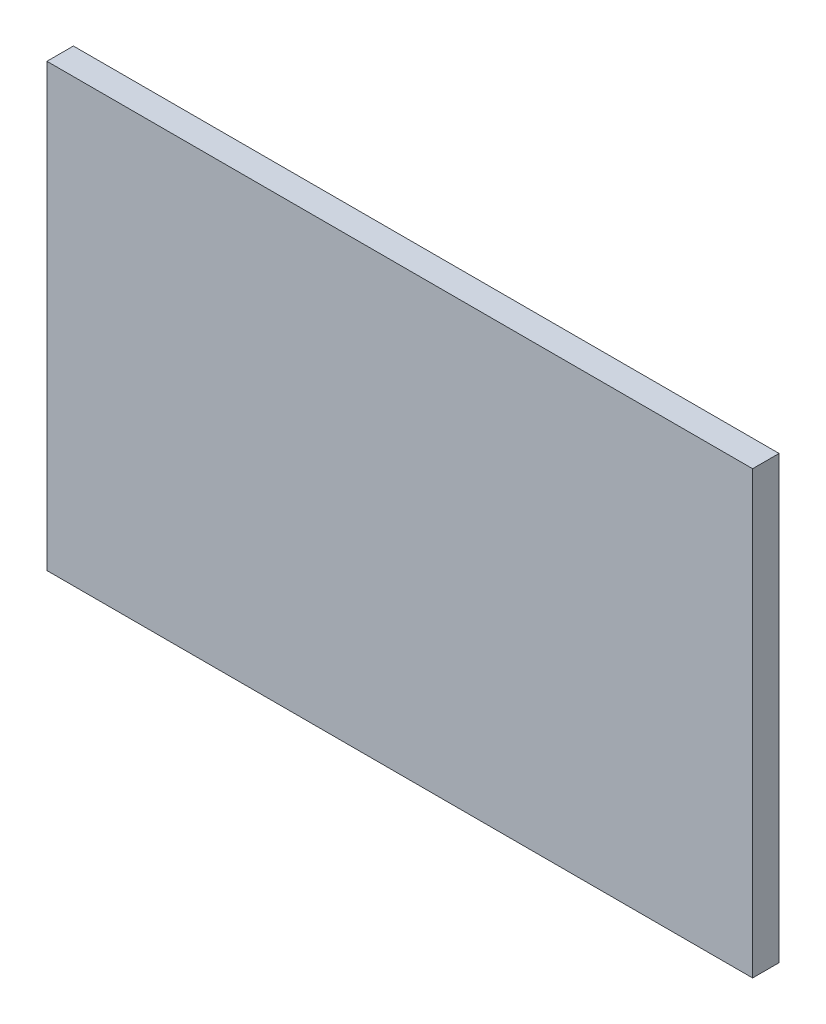
ISO-10303-21;
HEADER;
FILE_DESCRIPTION(('STEP AP214'),'2;1');
FILE_NAME('part.step','',(''),(''),'','','');
FILE_SCHEMA(('AUTOMOTIVE_DESIGN { 1 0 10303 214 1 1 1 1 }'));
ENDSEC;
DATA;
#1=APPLICATION_CONTEXT('core data for automotive mechanical design processes');
#2=APPLICATION_PROTOCOL_DEFINITION('international standard','automotive_design',2000,#1);
#3=PRODUCT_CONTEXT('',#1,'mechanical');
#4=PRODUCT('Part','Part','',(#3));
#5=PRODUCT_RELATED_PRODUCT_CATEGORY('part','',(#4));
#6=PRODUCT_DEFINITION_FORMATION('','',#4);
#7=PRODUCT_DEFINITION_CONTEXT('part definition',#1,'design');
#8=PRODUCT_DEFINITION('design','',#6,#7);
#9=PRODUCT_DEFINITION_SHAPE('','',#8);
#10=(LENGTH_UNIT() NAMED_UNIT(*) SI_UNIT(.MILLI.,.METRE.));
#11=(NAMED_UNIT(*) PLANE_ANGLE_UNIT() SI_UNIT($,.RADIAN.));
#12=(NAMED_UNIT(*) SI_UNIT($,.STERADIAN.) SOLID_ANGLE_UNIT());
#13=UNCERTAINTY_MEASURE_WITH_UNIT(LENGTH_MEASURE(1.E-05),#10,'distance_accuracy_value','');
#14=(GEOMETRIC_REPRESENTATION_CONTEXT(3) GLOBAL_UNCERTAINTY_ASSIGNED_CONTEXT((#13)) GLOBAL_UNIT_ASSIGNED_CONTEXT((#10,
#11,#12)) REPRESENTATION_CONTEXT('',''));
#15=CARTESIAN_POINT('',(0.,0.,0.));
#16=DIRECTION('',(0.,0.,1.));
#17=DIRECTION('',(1.,0.,0.));
#18=AXIS2_PLACEMENT_3D('',#15,#16,#17);
#19=CARTESIAN_POINT('',(-32.2239263803681,28.4851107338103,3.));
#20=DIRECTION('',(1.,0.,0.));
#21=DIRECTION('',(0.,1.,0.));
#22=AXIS2_PLACEMENT_3D('',#19,#20,#21);
#23=PLANE('',#22);
#24=DIRECTION('',(0.,-1.,0.));
#25=VECTOR('',#24,1.);
#26=CARTESIAN_POINT('',(-32.2239263803681,28.4851107338103,0.));
#27=LINE('',#26,#25);
#28=CARTESIAN_POINT('',(-32.2239263803681,28.4851107338103,0.));
#29=VERTEX_POINT('',#28);
#30=CARTESIAN_POINT('',(-32.2239263803681,-21.5148892661896,0.));
#31=VERTEX_POINT('',#30);
#32=EDGE_CURVE('E111',#29,#31,#27,.T.);
#33=ORIENTED_EDGE('',*,*,#32,.T.);
#34=DIRECTION('',(0.,0.,-1.));
#35=VECTOR('',#34,1.);
#36=CARTESIAN_POINT('',(-32.2239263803681,-21.5148892661896,3.));
#37=LINE('',#36,#35);
#38=CARTESIAN_POINT('',(-32.2239263803681,-21.5148892661896,3.));
#39=VERTEX_POINT('',#38);
#40=EDGE_CURVE('E11',#39,#31,#37,.T.);
#41=ORIENTED_EDGE('',*,*,#40,.F.);
#42=DIRECTION('',(0.,-1.,0.));
#43=VECTOR('',#42,1.);
#44=CARTESIAN_POINT('',(-32.2239263803681,28.4851107338103,3.));
#45=LINE('',#44,#43);
#46=CARTESIAN_POINT('',(-32.2239263803681,28.4851107338103,3.));
#47=VERTEX_POINT('',#46);
#48=EDGE_CURVE('E95',#47,#39,#45,.T.);
#49=ORIENTED_EDGE('',*,*,#48,.F.);
#50=DIRECTION('',(0.,0.,-1.));
#51=VECTOR('',#50,1.);
#52=CARTESIAN_POINT('',(-32.2239263803681,28.4851107338103,3.));
#53=LINE('',#52,#51);
#54=EDGE_CURVE('E107',#47,#29,#53,.T.);
#55=ORIENTED_EDGE('',*,*,#54,.T.);
#56=EDGE_LOOP('',(#33,#41,#49,#55));
#57=FACE_BOUND('',#56,.T.);
#58=ADVANCED_FACE('F43',(#57),#23,.F.);
#59=CARTESIAN_POINT('',(-32.2239263803681,-21.5148892661896,3.));
#60=DIRECTION('',(0.,1.,0.));
#61=DIRECTION('',(0.,0.,1.));
#62=AXIS2_PLACEMENT_3D('',#59,#60,#61);
#63=PLANE('',#62);
#64=DIRECTION('',(1.,0.,0.));
#65=VECTOR('',#64,1.);
#66=CARTESIAN_POINT('',(-32.2239263803681,-21.5148892661896,0.));
#67=LINE('',#66,#65);
#68=CARTESIAN_POINT('',(47.7760736196319,-21.5148892661896,0.));
#69=VERTEX_POINT('',#68);
#70=EDGE_CURVE('E100',#31,#69,#67,.T.);
#71=ORIENTED_EDGE('',*,*,#70,.T.);
#72=DIRECTION('',(0.,0.,-1.));
#73=VECTOR('',#72,1.);
#74=CARTESIAN_POINT('',(47.7760736196319,-21.5148892661896,3.));
#75=LINE('',#74,#73);
#76=CARTESIAN_POINT('',(47.7760736196319,-21.5148892661896,3.));
#77=VERTEX_POINT('',#76);
#78=EDGE_CURVE('E52',#77,#69,#75,.T.);
#79=ORIENTED_EDGE('',*,*,#78,.F.);
#80=DIRECTION('',(1.,0.,0.));
#81=VECTOR('',#80,1.);
#82=CARTESIAN_POINT('',(-32.2239263803681,-21.5148892661896,3.));
#83=LINE('',#82,#81);
#84=EDGE_CURVE('E90',#39,#77,#83,.T.);
#85=ORIENTED_EDGE('',*,*,#84,.F.);
#86=ORIENTED_EDGE('',*,*,#40,.T.);
#87=EDGE_LOOP('',(#71,#79,#85,#86));
#88=FACE_BOUND('',#87,.T.);
#89=ADVANCED_FACE('F99',(#88),#63,.F.);
#90=CARTESIAN_POINT('',(47.7760736196319,28.4851107338104,3.));
#91=DIRECTION('',(-1.,0.,0.));
#92=DIRECTION('',(0.,0.,1.));
#93=AXIS2_PLACEMENT_3D('',#90,#91,#92);
#94=PLANE('',#93);
#95=DIRECTION('',(0.,1.,0.));
#96=VECTOR('',#95,1.);
#97=CARTESIAN_POINT('',(47.7760736196319,28.4851107338104,0.));
#98=LINE('',#97,#96);
#99=CARTESIAN_POINT('',(47.7760736196319,28.4851107338104,0.));
#100=VERTEX_POINT('',#99);
#101=EDGE_CURVE('E77',#69,#100,#98,.T.);
#102=ORIENTED_EDGE('',*,*,#101,.T.);
#103=DIRECTION('',(0.,0.,-1.));
#104=VECTOR('',#103,1.);
#105=CARTESIAN_POINT('',(47.7760736196319,28.4851107338104,3.));
#106=LINE('',#105,#104);
#107=CARTESIAN_POINT('',(47.7760736196319,28.4851107338104,3.));
#108=VERTEX_POINT('',#107);
#109=EDGE_CURVE('E102',#108,#100,#106,.T.);
#110=ORIENTED_EDGE('',*,*,#109,.F.);
#111=DIRECTION('',(0.,1.,0.));
#112=VECTOR('',#111,1.);
#113=CARTESIAN_POINT('',(47.7760736196319,28.4851107338104,3.));
#114=LINE('',#113,#112);
#115=EDGE_CURVE('E93',#77,#108,#114,.T.);
#116=ORIENTED_EDGE('',*,*,#115,.F.);
#117=ORIENTED_EDGE('',*,*,#78,.T.);
#118=EDGE_LOOP('',(#102,#110,#116,#117));
#119=FACE_BOUND('',#118,.T.);
#120=ADVANCED_FACE('F103',(#119),#94,.F.);
#121=CARTESIAN_POINT('',(-32.2239263803681,28.4851107338103,3.));
#122=DIRECTION('',(0.,-1.,0.));
#123=DIRECTION('',(1.,0.,0.));
#124=AXIS2_PLACEMENT_3D('',#121,#122,#123);
#125=PLANE('',#124);
#126=DIRECTION('',(-1.,0.,0.));
#127=VECTOR('',#126,1.);
#128=CARTESIAN_POINT('',(-32.2239263803681,28.4851107338103,0.));
#129=LINE('',#128,#127);
#130=EDGE_CURVE('E83',#100,#29,#129,.T.);
#131=ORIENTED_EDGE('',*,*,#130,.T.);
#132=ORIENTED_EDGE('',*,*,#54,.F.);
#133=DIRECTION('',(-1.,0.,0.));
#134=VECTOR('',#133,1.);
#135=CARTESIAN_POINT('',(-32.2239263803681,28.4851107338103,3.));
#136=LINE('',#135,#134);
#137=EDGE_CURVE('E60',#108,#47,#136,.T.);
#138=ORIENTED_EDGE('',*,*,#137,.F.);
#139=ORIENTED_EDGE('',*,*,#109,.T.);
#140=EDGE_LOOP('',(#131,#132,#138,#139));
#141=FACE_BOUND('',#140,.T.);
#142=ADVANCED_FACE('F124',(#141),#125,.F.);
#143=CARTESIAN_POINT('',(0.,0.,3.));
#144=DIRECTION('',(0.,0.,1.));
#145=DIRECTION('',(1.,0.,0.));
#146=AXIS2_PLACEMENT_3D('',#143,#144,#145);
#147=PLANE('',#146);
#148=ORIENTED_EDGE('',*,*,#48,.T.);
#149=ORIENTED_EDGE('',*,*,#84,.T.);
#150=ORIENTED_EDGE('',*,*,#115,.T.);
#151=ORIENTED_EDGE('',*,*,#137,.T.);
#152=EDGE_LOOP('',(#148,#149,#150,#151));
#153=FACE_BOUND('',#152,.T.);
#154=ADVANCED_FACE('F91',(#153),#147,.T.);
#155=CARTESIAN_POINT('',(0.,0.,0.));
#156=DIRECTION('',(0.,0.,1.));
#157=DIRECTION('',(1.,0.,0.));
#158=AXIS2_PLACEMENT_3D('',#155,#156,#157);
#159=PLANE('',#158);
#160=ORIENTED_EDGE('',*,*,#32,.F.);
#161=ORIENTED_EDGE('',*,*,#130,.F.);
#162=ORIENTED_EDGE('',*,*,#101,.F.);
#163=ORIENTED_EDGE('',*,*,#70,.F.);
#164=EDGE_LOOP('',(#160,#161,#162,#163));
#165=FACE_BOUND('',#164,.T.);
#166=ADVANCED_FACE('F127',(#165),#159,.F.);
#167=CLOSED_SHELL('',(#58,#89,#120,#142,#154,#166));
#168=MANIFOLD_SOLID_BREP('B2',#167);
#169=ADVANCED_BREP_SHAPE_REPRESENTATION('',(#18,#168),#14);
#170=SHAPE_DEFINITION_REPRESENTATION(#9,#169);
ENDSEC;
END-ISO-10303-21;
